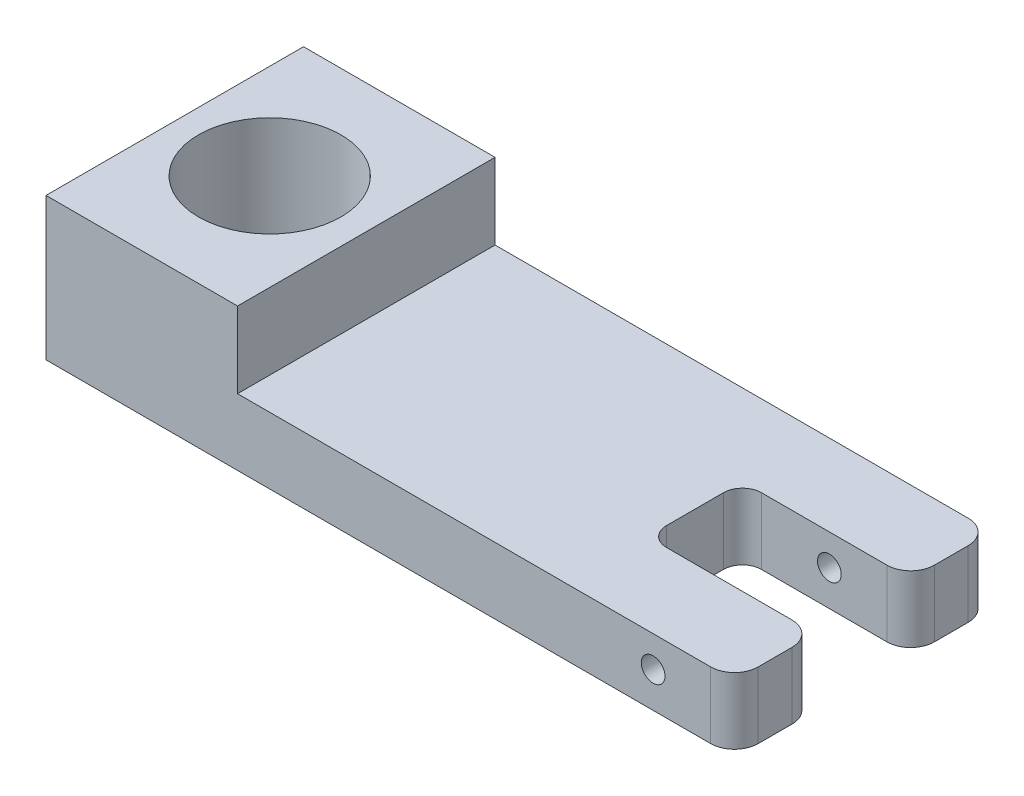
ISO-10303-21;
HEADER;
FILE_DESCRIPTION(('STEP AP214'),'2;1');
FILE_NAME('part.step','',(''),(''),'','','');
FILE_SCHEMA(('AUTOMOTIVE_DESIGN { 1 0 10303 214 1 1 1 1 }'));
ENDSEC;
DATA;
#1=APPLICATION_CONTEXT('core data for automotive mechanical design processes');
#2=APPLICATION_PROTOCOL_DEFINITION('international standard','automotive_design',2000,#1);
#3=PRODUCT_CONTEXT('',#1,'mechanical');
#4=PRODUCT('Part','Part','',(#3));
#5=PRODUCT_RELATED_PRODUCT_CATEGORY('part','',(#4));
#6=PRODUCT_DEFINITION_FORMATION('','',#4);
#7=PRODUCT_DEFINITION_CONTEXT('part definition',#1,'design');
#8=PRODUCT_DEFINITION('design','',#6,#7);
#9=PRODUCT_DEFINITION_SHAPE('','',#8);
#10=(LENGTH_UNIT() NAMED_UNIT(*) SI_UNIT(.MILLI.,.METRE.));
#11=(NAMED_UNIT(*) PLANE_ANGLE_UNIT() SI_UNIT($,.RADIAN.));
#12=(NAMED_UNIT(*) SI_UNIT($,.STERADIAN.) SOLID_ANGLE_UNIT());
#13=UNCERTAINTY_MEASURE_WITH_UNIT(LENGTH_MEASURE(1.E-05),#10,'distance_accuracy_value','');
#14=(GEOMETRIC_REPRESENTATION_CONTEXT(3) GLOBAL_UNCERTAINTY_ASSIGNED_CONTEXT((#13)) GLOBAL_UNIT_ASSIGNED_CONTEXT((#10,
#11,#12)) REPRESENTATION_CONTEXT('',''));
#15=CARTESIAN_POINT('',(0.,0.,0.));
#16=DIRECTION('',(0.,0.,1.));
#17=DIRECTION('',(1.,0.,0.));
#18=AXIS2_PLACEMENT_3D('',#15,#16,#17);
#19=CARTESIAN_POINT('',(125.,14.,27.1195704816793));
#20=DIRECTION('',(0.,1.,0.));
#21=DIRECTION('',(0.,0.,1.));
#22=AXIS2_PLACEMENT_3D('',#19,#20,#21);
#23=PLANE('',#22);
#24=DIRECTION('',(0.,0.,-1.));
#25=VECTOR('',#24,1.);
#26=CARTESIAN_POINT('',(20.3424895799387,14.,27.1195704816793));
#27=LINE('',#26,#25);
#28=CARTESIAN_POINT('',(20.3424895799387,14.,27.1195704816793));
#29=VERTEX_POINT('',#28);
#30=CARTESIAN_POINT('',(20.3424895799387,14.,-27.1195704816591));
#31=VERTEX_POINT('',#30);
#32=EDGE_CURVE('E49',#29,#31,#27,.T.);
#33=ORIENTED_EDGE('',*,*,#32,.F.);
#34=DIRECTION('',(1.,0.,0.));
#35=VECTOR('',#34,1.);
#36=CARTESIAN_POINT('',(-20.,14.,27.1195704816793));
#37=LINE('',#36,#35);
#38=CARTESIAN_POINT('',(120.,14.,27.1195704816793));
#39=VERTEX_POINT('',#38);
#40=EDGE_CURVE('E53',#29,#39,#37,.T.);
#41=ORIENTED_EDGE('',*,*,#40,.T.);
#42=CARTESIAN_POINT('',(120.,14.,22.1195704816793));
#43=DIRECTION('',(0.,1.,0.));
#44=DIRECTION('',(0.,0.,1.));
#45=AXIS2_PLACEMENT_3D('',#42,#43,#44);
#46=CIRCLE('',#45,5.);
#47=CARTESIAN_POINT('',(125.,14.,22.1195704816793));
#48=VERTEX_POINT('',#47);
#49=EDGE_CURVE('E235',#39,#48,#46,.T.);
#50=ORIENTED_EDGE('',*,*,#49,.T.);
#51=DIRECTION('',(0.,0.,-1.));
#52=VECTOR('',#51,1.);
#53=CARTESIAN_POINT('',(125.,14.,-27.1195704816591));
#54=LINE('',#53,#52);
#55=CARTESIAN_POINT('',(125.,14.,14.9999999999999));
#56=VERTEX_POINT('',#55);
#57=EDGE_CURVE('E201',#48,#56,#54,.T.);
#58=ORIENTED_EDGE('',*,*,#57,.T.);
#59=CARTESIAN_POINT('',(120.,14.,14.9999999999999));
#60=DIRECTION('',(0.,1.,0.));
#61=DIRECTION('',(0.,0.,1.));
#62=AXIS2_PLACEMENT_3D('',#59,#60,#61);
#63=CIRCLE('',#62,5.);
#64=CARTESIAN_POINT('',(120.,14.,9.99999999999989));
#65=VERTEX_POINT('',#64);
#66=EDGE_CURVE('E241',#56,#65,#63,.T.);
#67=ORIENTED_EDGE('',*,*,#66,.T.);
#68=DIRECTION('',(-1.,0.,0.));
#69=VECTOR('',#68,1.);
#70=CARTESIAN_POINT('',(125.,14.,9.99999999999989));
#71=LINE('',#70,#69);
#72=CARTESIAN_POINT('',(93.5690143293065,14.,9.99999999999989));
#73=VERTEX_POINT('',#72);
#74=EDGE_CURVE('E296',#65,#73,#71,.T.);
#75=ORIENTED_EDGE('',*,*,#74,.T.);
#76=CARTESIAN_POINT('',(93.5690143293065,14.,5.99999999999989));
#77=DIRECTION('',(0.,1.,0.));
#78=DIRECTION('',(0.,0.,1.));
#79=AXIS2_PLACEMENT_3D('',#76,#77,#78);
#80=CIRCLE('',#79,4.);
#81=CARTESIAN_POINT('',(89.5690146557837,14.,5.99838388802557));
#82=VERTEX_POINT('',#81);
#83=EDGE_CURVE('E295',#73,#82,#80,.F.);
#84=ORIENTED_EDGE('',*,*,#83,.T.);
#85=DIRECTION('',(0.000404027993581581,0.,-0.999999918380687));
#86=VECTOR('',#85,1.);
#87=CARTESIAN_POINT('',(89.5604868895439,14.,27.1052519251351));
#88=LINE('',#87,#86);
#89=CARTESIAN_POINT('',(89.5738629921024,14.,-6.00161611197443));
#90=VERTEX_POINT('',#89);
#91=EDGE_CURVE('E299',#82,#90,#88,.T.);
#92=ORIENTED_EDGE('',*,*,#91,.T.);
#93=CARTESIAN_POINT('',(93.5738626656251,14.,-6.00000000000011));
#94=DIRECTION('',(0.,1.,0.));
#95=DIRECTION('',(0.,0.,1.));
#96=AXIS2_PLACEMENT_3D('',#93,#94,#95);
#97=CIRCLE('',#96,3.99999999999999);
#98=CARTESIAN_POINT('',(93.5738626656251,14.,-10.0000000000001));
#99=VERTEX_POINT('',#98);
#100=EDGE_CURVE('E294',#90,#99,#97,.F.);
#101=ORIENTED_EDGE('',*,*,#100,.T.);
#102=DIRECTION('',(1.,0.,0.));
#103=VECTOR('',#102,1.);
#104=CARTESIAN_POINT('',(125.,14.,-10.0000000000001));
#105=LINE('',#104,#103);
#106=CARTESIAN_POINT('',(120.,14.,-10.0000000000001));
#107=VERTEX_POINT('',#106);
#108=EDGE_CURVE('E289',#99,#107,#105,.T.);
#109=ORIENTED_EDGE('',*,*,#108,.T.);
#110=CARTESIAN_POINT('',(120.,14.,-15.0000000000001));
#111=DIRECTION('',(0.,1.,0.));
#112=DIRECTION('',(0.,0.,1.));
#113=AXIS2_PLACEMENT_3D('',#110,#111,#112);
#114=CIRCLE('',#113,5.);
#115=CARTESIAN_POINT('',(125.,14.,-15.0000000000001));
#116=VERTEX_POINT('',#115);
#117=EDGE_CURVE('E239',#107,#116,#114,.T.);
#118=ORIENTED_EDGE('',*,*,#117,.T.);
#119=CARTESIAN_POINT('',(125.,14.,-22.1195704816591));
#120=VERTEX_POINT('',#119);
#121=EDGE_CURVE('E204',#116,#120,#54,.T.);
#122=ORIENTED_EDGE('',*,*,#121,.T.);
#123=CARTESIAN_POINT('',(120.,14.,-22.1195704816591));
#124=DIRECTION('',(0.,1.,0.));
#125=DIRECTION('',(0.,0.,1.));
#126=AXIS2_PLACEMENT_3D('',#123,#124,#125);
#127=CIRCLE('',#126,5.);
#128=CARTESIAN_POINT('',(120.,14.,-27.1195704816591));
#129=VERTEX_POINT('',#128);
#130=EDGE_CURVE('E237',#120,#129,#127,.T.);
#131=ORIENTED_EDGE('',*,*,#130,.T.);
#132=DIRECTION('',(-1.,0.,0.));
#133=VECTOR('',#132,1.);
#134=CARTESIAN_POINT('',(-20.,14.,-27.1195704816591));
#135=LINE('',#134,#133);
#136=EDGE_CURVE('E199',#129,#31,#135,.T.);
#137=ORIENTED_EDGE('',*,*,#136,.T.);
#138=EDGE_LOOP('',(#33,#41,#50,#58,#67,#75,#84,#92,#101,#109,#118,#122,#131,#137));
#139=FACE_BOUND('',#138,.T.);
#140=ADVANCED_FACE('F32',(#139),#23,.T.);
#141=CARTESIAN_POINT('',(125.,0.,27.1195704816793));
#142=DIRECTION('',(0.,1.,0.));
#143=DIRECTION('',(0.,0.,1.));
#144=AXIS2_PLACEMENT_3D('',#141,#142,#143);
#145=PLANE('',#144);
#146=CARTESIAN_POINT('',(0.,0.,0.));
#147=DIRECTION('',(0.,1.,0.));
#148=DIRECTION('',(0.,0.,1.));
#149=AXIS2_PLACEMENT_3D('',#146,#147,#148);
#150=CIRCLE('',#149,15.);
#151=CARTESIAN_POINT('',(0.,0.,15.));
#152=VERTEX_POINT('',#151);
#153=EDGE_CURVE('E212',#152,#152,#150,.T.);
#154=ORIENTED_EDGE('',*,*,#153,.T.);
#155=EDGE_LOOP('',(#154));
#156=FACE_BOUND('',#155,.T.);
#157=DIRECTION('',(1.,0.,0.));
#158=VECTOR('',#157,1.);
#159=CARTESIAN_POINT('',(93.5690143293065,0.,9.99999999999989));
#160=LINE('',#159,#158);
#161=CARTESIAN_POINT('',(93.5690143293065,0.,9.99999999999989));
#162=VERTEX_POINT('',#161);
#163=CARTESIAN_POINT('',(120.,0.,9.99999999999989));
#164=VERTEX_POINT('',#163);
#165=EDGE_CURVE('E399',#162,#164,#160,.T.);
#166=ORIENTED_EDGE('',*,*,#165,.T.);
#167=CARTESIAN_POINT('',(120.,0.,14.9999999999999));
#168=DIRECTION('',(0.,1.,0.));
#169=DIRECTION('',(0.,0.,1.));
#170=AXIS2_PLACEMENT_3D('',#167,#168,#169);
#171=CIRCLE('',#170,5.);
#172=CARTESIAN_POINT('',(125.,0.,14.9999999999999));
#173=VERTEX_POINT('',#172);
#174=EDGE_CURVE('E228',#164,#173,#171,.F.);
#175=ORIENTED_EDGE('',*,*,#174,.T.);
#176=DIRECTION('',(0.,0.,-1.));
#177=VECTOR('',#176,1.);
#178=CARTESIAN_POINT('',(125.,0.,-27.1195704816591));
#179=LINE('',#178,#177);
#180=CARTESIAN_POINT('',(125.,0.,22.1195704816793));
#181=VERTEX_POINT('',#180);
#182=EDGE_CURVE('E211',#181,#173,#179,.T.);
#183=ORIENTED_EDGE('',*,*,#182,.F.);
#184=CARTESIAN_POINT('',(120.,0.,22.1195704816793));
#185=DIRECTION('',(0.,1.,0.));
#186=DIRECTION('',(0.,0.,1.));
#187=AXIS2_PLACEMENT_3D('',#184,#185,#186);
#188=CIRCLE('',#187,5.);
#189=CARTESIAN_POINT('',(120.,0.,27.1195704816793));
#190=VERTEX_POINT('',#189);
#191=EDGE_CURVE('E222',#181,#190,#188,.F.);
#192=ORIENTED_EDGE('',*,*,#191,.T.);
#193=DIRECTION('',(1.,0.,0.));
#194=VECTOR('',#193,1.);
#195=CARTESIAN_POINT('',(-20.,0.,27.1195704816793));
#196=LINE('',#195,#194);
#197=CARTESIAN_POINT('',(-20.,0.,27.1195704816793));
#198=VERTEX_POINT('',#197);
#199=EDGE_CURVE('E216',#198,#190,#196,.T.);
#200=ORIENTED_EDGE('',*,*,#199,.F.);
#201=DIRECTION('',(0.,0.,1.));
#202=VECTOR('',#201,1.);
#203=CARTESIAN_POINT('',(-20.,0.,-27.1195704816591));
#204=LINE('',#203,#202);
#205=CARTESIAN_POINT('',(-20.,0.,-27.1195704816591));
#206=VERTEX_POINT('',#205);
#207=EDGE_CURVE('E151',#206,#198,#204,.T.);
#208=ORIENTED_EDGE('',*,*,#207,.F.);
#209=DIRECTION('',(-1.,0.,0.));
#210=VECTOR('',#209,1.);
#211=CARTESIAN_POINT('',(-20.,0.,-27.1195704816591));
#212=LINE('',#211,#210);
#213=CARTESIAN_POINT('',(120.,0.,-27.1195704816591));
#214=VERTEX_POINT('',#213);
#215=EDGE_CURVE('E213',#214,#206,#212,.T.);
#216=ORIENTED_EDGE('',*,*,#215,.F.);
#217=CARTESIAN_POINT('',(120.,0.,-22.1195704816591));
#218=DIRECTION('',(0.,1.,0.));
#219=DIRECTION('',(0.,0.,1.));
#220=AXIS2_PLACEMENT_3D('',#217,#218,#219);
#221=CIRCLE('',#220,5.);
#222=CARTESIAN_POINT('',(125.,0.,-22.1195704816591));
#223=VERTEX_POINT('',#222);
#224=EDGE_CURVE('E224',#214,#223,#221,.F.);
#225=ORIENTED_EDGE('',*,*,#224,.T.);
#226=CARTESIAN_POINT('',(125.,0.,-15.0000000000001));
#227=VERTEX_POINT('',#226);
#228=EDGE_CURVE('E208',#227,#223,#179,.T.);
#229=ORIENTED_EDGE('',*,*,#228,.F.);
#230=CARTESIAN_POINT('',(120.,0.,-15.0000000000001));
#231=DIRECTION('',(0.,1.,0.));
#232=DIRECTION('',(0.,0.,1.));
#233=AXIS2_PLACEMENT_3D('',#230,#231,#232);
#234=CIRCLE('',#233,5.);
#235=CARTESIAN_POINT('',(120.,0.,-10.0000000000001));
#236=VERTEX_POINT('',#235);
#237=EDGE_CURVE('E226',#227,#236,#234,.F.);
#238=ORIENTED_EDGE('',*,*,#237,.T.);
#239=DIRECTION('',(-1.,0.,0.));
#240=VECTOR('',#239,1.);
#241=CARTESIAN_POINT('',(93.5738626656251,0.,-10.0000000000001));
#242=LINE('',#241,#240);
#243=CARTESIAN_POINT('',(93.5738626656251,0.,-10.0000000000001));
#244=VERTEX_POINT('',#243);
#245=EDGE_CURVE('E291',#236,#244,#242,.T.);
#246=ORIENTED_EDGE('',*,*,#245,.T.);
#247=CARTESIAN_POINT('',(93.5738626656251,0.,-6.00000000000011));
#248=DIRECTION('',(0.,1.,0.));
#249=DIRECTION('',(0.,0.,1.));
#250=AXIS2_PLACEMENT_3D('',#247,#248,#249);
#251=CIRCLE('',#250,3.99999999999999);
#252=CARTESIAN_POINT('',(89.5738629921024,0.,-6.00161611197443));
#253=VERTEX_POINT('',#252);
#254=EDGE_CURVE('E387',#244,#253,#251,.T.);
#255=ORIENTED_EDGE('',*,*,#254,.T.);
#256=DIRECTION('',(-0.000404027993581581,0.,0.999999918380687));
#257=VECTOR('',#256,1.);
#258=CARTESIAN_POINT('',(89.5690146557837,0.,5.99838388802557));
#259=LINE('',#258,#257);
#260=CARTESIAN_POINT('',(89.5690146557837,0.,5.99838388802557));
#261=VERTEX_POINT('',#260);
#262=EDGE_CURVE('E393',#253,#261,#259,.T.);
#263=ORIENTED_EDGE('',*,*,#262,.T.);
#264=CARTESIAN_POINT('',(93.5690143293065,0.,5.99999999999989));
#265=DIRECTION('',(0.,1.,0.));
#266=DIRECTION('',(0.,0.,1.));
#267=AXIS2_PLACEMENT_3D('',#264,#265,#266);
#268=CIRCLE('',#267,4.);
#269=EDGE_CURVE('E396',#261,#162,#268,.T.);
#270=ORIENTED_EDGE('',*,*,#269,.T.);
#271=EDGE_LOOP('',(#166,#175,#183,#192,#200,#208,#216,#225,#229,#238,#246,#255,#263,#270));
#272=FACE_BOUND('',#271,.T.);
#273=ADVANCED_FACE('F259',(#156,#272),#145,.F.);
#274=CARTESIAN_POINT('',(125.,14.,-27.1195704816591));
#275=DIRECTION('',(-1.,0.,0.));
#276=DIRECTION('',(0.,0.,1.));
#277=AXIS2_PLACEMENT_3D('',#274,#275,#276);
#278=PLANE('',#277);
#279=ORIENTED_EDGE('',*,*,#121,.F.);
#280=DIRECTION('',(0.,1.,0.));
#281=VECTOR('',#280,1.);
#282=CARTESIAN_POINT('',(125.,0.,-15.0000000000001));
#283=LINE('',#282,#281);
#284=EDGE_CURVE('E248',#116,#227,#283,.F.);
#285=ORIENTED_EDGE('',*,*,#284,.T.);
#286=ORIENTED_EDGE('',*,*,#228,.T.);
#287=DIRECTION('',(0.,-1.,0.));
#288=VECTOR('',#287,1.);
#289=CARTESIAN_POINT('',(125.,14.,-22.1195704816591));
#290=LINE('',#289,#288);
#291=EDGE_CURVE('E246',#223,#120,#290,.F.);
#292=ORIENTED_EDGE('',*,*,#291,.T.);
#293=EDGE_LOOP('',(#279,#285,#286,#292));
#294=FACE_BOUND('',#293,.T.);
#295=ADVANCED_FACE('F280',(#294),#278,.F.);
#296=ORIENTED_EDGE('',*,*,#182,.T.);
#297=DIRECTION('',(0.,-1.,0.));
#298=VECTOR('',#297,1.);
#299=CARTESIAN_POINT('',(125.,14.,14.9999999999999));
#300=LINE('',#299,#298);
#301=EDGE_CURVE('E233',#173,#56,#300,.F.);
#302=ORIENTED_EDGE('',*,*,#301,.T.);
#303=ORIENTED_EDGE('',*,*,#57,.F.);
#304=DIRECTION('',(0.,-1.,0.));
#305=VECTOR('',#304,1.);
#306=CARTESIAN_POINT('',(125.,14.,22.1195704816793));
#307=LINE('',#306,#305);
#308=EDGE_CURVE('E230',#48,#181,#307,.T.);
#309=ORIENTED_EDGE('',*,*,#308,.T.);
#310=EDGE_LOOP('',(#296,#302,#303,#309));
#311=FACE_BOUND('',#310,.T.);
#312=ADVANCED_FACE('F271',(#311),#278,.F.);
#313=CARTESIAN_POINT('',(-20.,14.,-27.1195704816591));
#314=DIRECTION('',(0.,0.,1.));
#315=DIRECTION('',(1.,0.,0.));
#316=AXIS2_PLACEMENT_3D('',#313,#314,#315);
#317=PLANE('',#316);
#318=CARTESIAN_POINT('',(107.871367234566,7.46112959486413,-27.1195704816591));
#319=DIRECTION('',(0.,0.,1.));
#320=DIRECTION('',(1.,0.,0.));
#321=AXIS2_PLACEMENT_3D('',#318,#319,#320);
#322=CIRCLE('',#321,2.49999999999999);
#323=CARTESIAN_POINT('',(110.371367234566,7.46112959486413,-27.1195704816591));
#324=VERTEX_POINT('',#323);
#325=EDGE_CURVE('E385',#324,#324,#322,.T.);
#326=ORIENTED_EDGE('',*,*,#325,.T.);
#327=EDGE_LOOP('',(#326));
#328=FACE_BOUND('',#327,.T.);
#329=ORIENTED_EDGE('',*,*,#136,.F.);
#330=DIRECTION('',(0.,-1.,0.));
#331=VECTOR('',#330,1.);
#332=CARTESIAN_POINT('',(120.,14.,-27.1195704816591));
#333=LINE('',#332,#331);
#334=EDGE_CURVE('E41',#129,#214,#333,.T.);
#335=ORIENTED_EDGE('',*,*,#334,.T.);
#336=ORIENTED_EDGE('',*,*,#215,.T.);
#337=DIRECTION('',(0.,-1.,0.));
#338=VECTOR('',#337,1.);
#339=CARTESIAN_POINT('',(-20.,14.,-27.1195704816591));
#340=LINE('',#339,#338);
#341=CARTESIAN_POINT('',(-20.,30.,-27.1195704816591));
#342=VERTEX_POINT('',#341);
#343=EDGE_CURVE('E155',#342,#206,#340,.T.);
#344=ORIENTED_EDGE('',*,*,#343,.F.);
#345=DIRECTION('',(-1.,0.,0.));
#346=VECTOR('',#345,1.);
#347=CARTESIAN_POINT('',(-20.,30.,-27.1195704816591));
#348=LINE('',#347,#346);
#349=CARTESIAN_POINT('',(20.3424895799387,30.,-27.1195704816591));
#350=VERTEX_POINT('',#349);
#351=EDGE_CURVE('E170',#350,#342,#348,.T.);
#352=ORIENTED_EDGE('',*,*,#351,.F.);
#353=DIRECTION('',(0.,-1.,0.));
#354=VECTOR('',#353,1.);
#355=CARTESIAN_POINT('',(20.3424895799387,30.,-27.1195704816591));
#356=LINE('',#355,#354);
#357=EDGE_CURVE('E178',#350,#31,#356,.T.);
#358=ORIENTED_EDGE('',*,*,#357,.T.);
#359=EDGE_LOOP('',(#329,#335,#336,#344,#352,#358));
#360=FACE_BOUND('',#359,.T.);
#361=ADVANCED_FACE('F254',(#328,#360),#317,.F.);
#362=CARTESIAN_POINT('',(-20.,14.,-27.1195704816591));
#363=DIRECTION('',(1.,0.,0.));
#364=DIRECTION('',(0.,0.,-1.));
#365=AXIS2_PLACEMENT_3D('',#362,#363,#364);
#366=PLANE('',#365);
#367=ORIENTED_EDGE('',*,*,#207,.T.);
#368=DIRECTION('',(0.,-1.,0.));
#369=VECTOR('',#368,1.);
#370=CARTESIAN_POINT('',(-20.,14.,27.1195704816793));
#371=LINE('',#370,#369);
#372=CARTESIAN_POINT('',(-20.,30.,27.1195704816793));
#373=VERTEX_POINT('',#372);
#374=EDGE_CURVE('E144',#373,#198,#371,.T.);
#375=ORIENTED_EDGE('',*,*,#374,.F.);
#376=DIRECTION('',(0.,0.,1.));
#377=VECTOR('',#376,1.);
#378=CARTESIAN_POINT('',(-20.,30.,27.1195704816793));
#379=LINE('',#378,#377);
#380=EDGE_CURVE('E149',#342,#373,#379,.T.);
#381=ORIENTED_EDGE('',*,*,#380,.F.);
#382=ORIENTED_EDGE('',*,*,#343,.T.);
#383=EDGE_LOOP('',(#367,#375,#381,#382));
#384=FACE_BOUND('',#383,.T.);
#385=ADVANCED_FACE('F146',(#384),#366,.F.);
#386=CARTESIAN_POINT('',(-20.,14.,27.1195704816793));
#387=DIRECTION('',(0.,0.,-1.));
#388=DIRECTION('',(-1.,0.,0.));
#389=AXIS2_PLACEMENT_3D('',#386,#387,#388);
#390=PLANE('',#389);
#391=CARTESIAN_POINT('',(107.871367234566,7.46112959486413,27.1195704816793));
#392=DIRECTION('',(0.,0.,-1.));
#393=DIRECTION('',(-1.,0.,0.));
#394=AXIS2_PLACEMENT_3D('',#391,#392,#393);
#395=CIRCLE('',#394,2.49999999999999);
#396=CARTESIAN_POINT('',(105.371367234566,7.46112959486413,27.1195704816793));
#397=VERTEX_POINT('',#396);
#398=EDGE_CURVE('E197',#397,#397,#395,.T.);
#399=ORIENTED_EDGE('',*,*,#398,.T.);
#400=EDGE_LOOP('',(#399));
#401=FACE_BOUND('',#400,.T.);
#402=ORIENTED_EDGE('',*,*,#199,.T.);
#403=DIRECTION('',(0.,-1.,0.));
#404=VECTOR('',#403,1.);
#405=CARTESIAN_POINT('',(120.,14.,27.1195704816793));
#406=LINE('',#405,#404);
#407=EDGE_CURVE('E11',#190,#39,#406,.F.);
#408=ORIENTED_EDGE('',*,*,#407,.T.);
#409=ORIENTED_EDGE('',*,*,#40,.F.);
#410=DIRECTION('',(0.,-1.,0.));
#411=VECTOR('',#410,1.);
#412=CARTESIAN_POINT('',(20.3424895799387,30.,27.1195704816793));
#413=LINE('',#412,#411);
#414=CARTESIAN_POINT('',(20.3424895799387,30.,27.1195704816793));
#415=VERTEX_POINT('',#414);
#416=EDGE_CURVE('E161',#415,#29,#413,.T.);
#417=ORIENTED_EDGE('',*,*,#416,.F.);
#418=DIRECTION('',(1.,0.,0.));
#419=VECTOR('',#418,1.);
#420=CARTESIAN_POINT('',(-20.,30.,27.1195704816793));
#421=LINE('',#420,#419);
#422=EDGE_CURVE('E158',#373,#415,#421,.T.);
#423=ORIENTED_EDGE('',*,*,#422,.F.);
#424=ORIENTED_EDGE('',*,*,#374,.T.);
#425=EDGE_LOOP('',(#402,#408,#409,#417,#423,#424));
#426=FACE_BOUND('',#425,.T.);
#427=ADVANCED_FACE('F159',(#401,#426),#390,.F.);
#428=CARTESIAN_POINT('',(0.,14.,0.));
#429=DIRECTION('',(0.,-1.,0.));
#430=DIRECTION('',(0.,0.,-1.));
#431=AXIS2_PLACEMENT_3D('',#428,#429,#430);
#432=CYLINDRICAL_SURFACE('',#431,15.);
#433=ORIENTED_EDGE('',*,*,#153,.F.);
#434=EDGE_LOOP('',(#433));
#435=FACE_BOUND('',#434,.T.);
#436=CARTESIAN_POINT('',(0.,30.,0.));
#437=DIRECTION('',(0.,1.,0.));
#438=DIRECTION('',(0.,0.,1.));
#439=AXIS2_PLACEMENT_3D('',#436,#437,#438);
#440=CIRCLE('',#439,15.);
#441=CARTESIAN_POINT('',(0.,30.,15.));
#442=VERTEX_POINT('',#441);
#443=EDGE_CURVE('E172',#442,#442,#440,.T.);
#444=ORIENTED_EDGE('',*,*,#443,.T.);
#445=EDGE_LOOP('',(#444));
#446=FACE_BOUND('',#445,.T.);
#447=ADVANCED_FACE('F310',(#435,#446),#432,.F.);
#448=CARTESIAN_POINT('',(93.5738626656251,50.,-10.0000000000001));
#449=DIRECTION('',(0.,0.,1.));
#450=DIRECTION('',(1.,0.,0.));
#451=AXIS2_PLACEMENT_3D('',#448,#449,#450);
#452=PLANE('',#451);
#453=CARTESIAN_POINT('',(107.871367234566,7.46112959486413,-10.0000000000001));
#454=DIRECTION('',(0.,0.,1.));
#455=DIRECTION('',(1.,0.,0.));
#456=AXIS2_PLACEMENT_3D('',#453,#454,#455);
#457=CIRCLE('',#456,2.49999999999999);
#458=CARTESIAN_POINT('',(110.371367234566,7.46112959486413,-10.0000000000001));
#459=VERTEX_POINT('',#458);
#460=EDGE_CURVE('E181',#459,#459,#457,.T.);
#461=ORIENTED_EDGE('',*,*,#460,.F.);
#462=EDGE_LOOP('',(#461));
#463=FACE_BOUND('',#462,.T.);
#464=ORIENTED_EDGE('',*,*,#245,.F.);
#465=DIRECTION('',(0.,1.,0.));
#466=VECTOR('',#465,1.);
#467=CARTESIAN_POINT('',(120.,14.,-10.0000000000001));
#468=LINE('',#467,#466);
#469=EDGE_CURVE('E243',#236,#107,#468,.T.);
#470=ORIENTED_EDGE('',*,*,#469,.T.);
#471=ORIENTED_EDGE('',*,*,#108,.F.);
#472=DIRECTION('',(0.,-1.,0.));
#473=VECTOR('',#472,1.);
#474=CARTESIAN_POINT('',(93.5738626656251,50.,-10.0000000000001));
#475=LINE('',#474,#473);
#476=EDGE_CURVE('E301',#99,#244,#475,.T.);
#477=ORIENTED_EDGE('',*,*,#476,.T.);
#478=EDGE_LOOP('',(#464,#470,#471,#477));
#479=FACE_BOUND('',#478,.T.);
#480=ADVANCED_FACE('F287',(#463,#479),#452,.T.);
#481=CARTESIAN_POINT('',(93.5738626656251,50.,-6.00000000000011));
#482=DIRECTION('',(0.,-1.,0.));
#483=DIRECTION('',(0.,0.,-1.));
#484=AXIS2_PLACEMENT_3D('',#481,#482,#483);
#485=CYLINDRICAL_SURFACE('',#484,3.99999999999999);
#486=DIRECTION('',(0.,-1.,0.));
#487=VECTOR('',#486,1.);
#488=CARTESIAN_POINT('',(89.5738629921024,50.,-6.00161611197443));
#489=LINE('',#488,#487);
#490=EDGE_CURVE('E405',#90,#253,#489,.T.);
#491=ORIENTED_EDGE('',*,*,#490,.T.);
#492=ORIENTED_EDGE('',*,*,#254,.F.);
#493=ORIENTED_EDGE('',*,*,#476,.F.);
#494=ORIENTED_EDGE('',*,*,#100,.F.);
#495=EDGE_LOOP('',(#491,#492,#493,#494));
#496=FACE_BOUND('',#495,.T.);
#497=ADVANCED_FACE('F373',(#496),#485,.F.);
#498=CARTESIAN_POINT('',(89.5690146557837,50.,5.99838388802557));
#499=DIRECTION('',(0.999999918380687,0.,0.000404027993581581));
#500=DIRECTION('',(0.000404027993581581,0.,-0.999999918380687));
#501=AXIS2_PLACEMENT_3D('',#498,#499,#500);
#502=PLANE('',#501);
#503=DIRECTION('',(0.,-1.,0.));
#504=VECTOR('',#503,1.);
#505=CARTESIAN_POINT('',(89.5690146557837,50.,5.99838388802557));
#506=LINE('',#505,#504);
#507=EDGE_CURVE('E403',#82,#261,#506,.T.);
#508=ORIENTED_EDGE('',*,*,#507,.T.);
#509=ORIENTED_EDGE('',*,*,#262,.F.);
#510=ORIENTED_EDGE('',*,*,#490,.F.);
#511=ORIENTED_EDGE('',*,*,#91,.F.);
#512=EDGE_LOOP('',(#508,#509,#510,#511));
#513=FACE_BOUND('',#512,.T.);
#514=ADVANCED_FACE('F369',(#513),#502,.T.);
#515=CARTESIAN_POINT('',(93.5690143293065,50.,5.99999999999989));
#516=DIRECTION('',(0.,-1.,0.));
#517=DIRECTION('',(0.,0.,-1.));
#518=AXIS2_PLACEMENT_3D('',#515,#516,#517);
#519=CYLINDRICAL_SURFACE('',#518,4.);
#520=DIRECTION('',(0.,-1.,0.));
#521=VECTOR('',#520,1.);
#522=CARTESIAN_POINT('',(93.5690143293065,50.,9.99999999999989));
#523=LINE('',#522,#521);
#524=EDGE_CURVE('E401',#73,#162,#523,.T.);
#525=ORIENTED_EDGE('',*,*,#524,.T.);
#526=ORIENTED_EDGE('',*,*,#269,.F.);
#527=ORIENTED_EDGE('',*,*,#507,.F.);
#528=ORIENTED_EDGE('',*,*,#83,.F.);
#529=EDGE_LOOP('',(#525,#526,#527,#528));
#530=FACE_BOUND('',#529,.T.);
#531=ADVANCED_FACE('F365',(#530),#519,.F.);
#532=CARTESIAN_POINT('',(93.5690143293065,50.,9.99999999999989));
#533=DIRECTION('',(0.,0.,-1.));
#534=DIRECTION('',(-1.,0.,0.));
#535=AXIS2_PLACEMENT_3D('',#532,#533,#534);
#536=PLANE('',#535);
#537=CARTESIAN_POINT('',(107.871367234566,7.46112959486413,9.99999999999989));
#538=DIRECTION('',(0.,0.,-1.));
#539=DIRECTION('',(-1.,0.,0.));
#540=AXIS2_PLACEMENT_3D('',#537,#538,#539);
#541=CIRCLE('',#540,2.49999999999999);
#542=CARTESIAN_POINT('',(105.371367234566,7.46112959486413,9.99999999999989));
#543=VERTEX_POINT('',#542);
#544=EDGE_CURVE('E190',#543,#543,#541,.T.);
#545=ORIENTED_EDGE('',*,*,#544,.F.);
#546=EDGE_LOOP('',(#545));
#547=FACE_BOUND('',#546,.T.);
#548=ORIENTED_EDGE('',*,*,#74,.F.);
#549=DIRECTION('',(0.,-1.,0.));
#550=VECTOR('',#549,1.);
#551=CARTESIAN_POINT('',(120.,0.,9.99999999999989));
#552=LINE('',#551,#550);
#553=EDGE_CURVE('E219',#65,#164,#552,.T.);
#554=ORIENTED_EDGE('',*,*,#553,.T.);
#555=ORIENTED_EDGE('',*,*,#165,.F.);
#556=ORIENTED_EDGE('',*,*,#524,.F.);
#557=EDGE_LOOP('',(#548,#554,#555,#556));
#558=FACE_BOUND('',#557,.T.);
#559=ADVANCED_FACE('F349',(#547,#558),#536,.T.);
#560=CARTESIAN_POINT('',(120.,50.,14.9999999999999));
#561=DIRECTION('',(0.,1.,0.));
#562=DIRECTION('',(0.,0.,1.));
#563=AXIS2_PLACEMENT_3D('',#560,#561,#562);
#564=CYLINDRICAL_SURFACE('',#563,5.);
#565=ORIENTED_EDGE('',*,*,#66,.F.);
#566=ORIENTED_EDGE('',*,*,#301,.F.);
#567=ORIENTED_EDGE('',*,*,#174,.F.);
#568=ORIENTED_EDGE('',*,*,#553,.F.);
#569=EDGE_LOOP('',(#565,#566,#567,#568));
#570=FACE_BOUND('',#569,.T.);
#571=ADVANCED_FACE('F346',(#570),#564,.T.);
#572=CARTESIAN_POINT('',(120.,50.,-15.0000000000001));
#573=DIRECTION('',(0.,-1.,0.));
#574=DIRECTION('',(0.,0.,-1.));
#575=AXIS2_PLACEMENT_3D('',#572,#573,#574);
#576=CYLINDRICAL_SURFACE('',#575,5.);
#577=ORIENTED_EDGE('',*,*,#237,.F.);
#578=ORIENTED_EDGE('',*,*,#284,.F.);
#579=ORIENTED_EDGE('',*,*,#117,.F.);
#580=ORIENTED_EDGE('',*,*,#469,.F.);
#581=EDGE_LOOP('',(#577,#578,#579,#580));
#582=FACE_BOUND('',#581,.T.);
#583=ADVANCED_FACE('F285',(#582),#576,.T.);
#584=CARTESIAN_POINT('',(120.,14.,-22.1195704816591));
#585=DIRECTION('',(0.,-1.,0.));
#586=DIRECTION('',(0.,0.,-1.));
#587=AXIS2_PLACEMENT_3D('',#584,#585,#586);
#588=CYLINDRICAL_SURFACE('',#587,5.);
#589=ORIENTED_EDGE('',*,*,#130,.F.);
#590=ORIENTED_EDGE('',*,*,#291,.F.);
#591=ORIENTED_EDGE('',*,*,#224,.F.);
#592=ORIENTED_EDGE('',*,*,#334,.F.);
#593=EDGE_LOOP('',(#589,#590,#591,#592));
#594=FACE_BOUND('',#593,.T.);
#595=ADVANCED_FACE('F279',(#594),#588,.T.);
#596=CARTESIAN_POINT('',(120.,14.,22.1195704816793));
#597=DIRECTION('',(0.,-1.,0.));
#598=DIRECTION('',(0.,0.,-1.));
#599=AXIS2_PLACEMENT_3D('',#596,#597,#598);
#600=CYLINDRICAL_SURFACE('',#599,5.);
#601=ORIENTED_EDGE('',*,*,#49,.F.);
#602=ORIENTED_EDGE('',*,*,#407,.F.);
#603=ORIENTED_EDGE('',*,*,#191,.F.);
#604=ORIENTED_EDGE('',*,*,#308,.F.);
#605=EDGE_LOOP('',(#601,#602,#603,#604));
#606=FACE_BOUND('',#605,.T.);
#607=ADVANCED_FACE('F34',(#606),#600,.T.);
#608=CARTESIAN_POINT('',(107.871367234566,7.46112959486413,-36.));
#609=DIRECTION('',(0.,0.,1.));
#610=DIRECTION('',(1.,0.,0.));
#611=AXIS2_PLACEMENT_3D('',#608,#609,#610);
#612=CYLINDRICAL_SURFACE('',#611,2.49999999999999);
#613=ORIENTED_EDGE('',*,*,#544,.T.);
#614=EDGE_LOOP('',(#613));
#615=FACE_BOUND('',#614,.T.);
#616=ORIENTED_EDGE('',*,*,#398,.F.);
#617=EDGE_LOOP('',(#616));
#618=FACE_BOUND('',#617,.T.);
#619=ADVANCED_FACE('F325',(#615,#618),#612,.F.);
#620=ORIENTED_EDGE('',*,*,#460,.T.);
#621=EDGE_LOOP('',(#620));
#622=FACE_BOUND('',#621,.T.);
#623=ORIENTED_EDGE('',*,*,#325,.F.);
#624=EDGE_LOOP('',(#623));
#625=FACE_BOUND('',#624,.T.);
#626=ADVANCED_FACE('F318',(#622,#625),#612,.F.);
#627=CARTESIAN_POINT('',(-20.,30.,-27.1195704816591));
#628=DIRECTION('',(0.,-1.,0.));
#629=DIRECTION('',(0.,0.,-1.));
#630=AXIS2_PLACEMENT_3D('',#627,#628,#629);
#631=PLANE('',#630);
#632=ORIENTED_EDGE('',*,*,#380,.T.);
#633=ORIENTED_EDGE('',*,*,#422,.T.);
#634=DIRECTION('',(0.,0.,-1.));
#635=VECTOR('',#634,1.);
#636=CARTESIAN_POINT('',(20.3424895799387,30.,27.1195704816793));
#637=LINE('',#636,#635);
#638=EDGE_CURVE('E164',#415,#350,#637,.T.);
#639=ORIENTED_EDGE('',*,*,#638,.T.);
#640=ORIENTED_EDGE('',*,*,#351,.T.);
#641=EDGE_LOOP('',(#632,#633,#639,#640));
#642=FACE_BOUND('',#641,.T.);
#643=ORIENTED_EDGE('',*,*,#443,.F.);
#644=EDGE_LOOP('',(#643));
#645=FACE_BOUND('',#644,.T.);
#646=ADVANCED_FACE('F167',(#642,#645),#631,.F.);
#647=CARTESIAN_POINT('',(20.3424895799387,30.,27.1195704816793));
#648=DIRECTION('',(-1.,0.,0.));
#649=DIRECTION('',(0.,0.,1.));
#650=AXIS2_PLACEMENT_3D('',#647,#648,#649);
#651=PLANE('',#650);
#652=ORIENTED_EDGE('',*,*,#32,.T.);
#653=ORIENTED_EDGE('',*,*,#357,.F.);
#654=ORIENTED_EDGE('',*,*,#638,.F.);
#655=ORIENTED_EDGE('',*,*,#416,.T.);
#656=EDGE_LOOP('',(#652,#653,#654,#655));
#657=FACE_BOUND('',#656,.T.);
#658=ADVANCED_FACE('F317',(#657),#651,.F.);
#659=CLOSED_SHELL('',(#140,#273,#295,#312,#361,#385,#427,#447,#480,#497,#514,#531,#559,#571,
#583,#595,#607,#619,#626,#646,#658));
#660=MANIFOLD_SOLID_BREP('B2',#659);
#661=ADVANCED_BREP_SHAPE_REPRESENTATION('',(#18,#660),#14);
#662=SHAPE_DEFINITION_REPRESENTATION(#9,#661);
ENDSEC;
END-ISO-10303-21;
